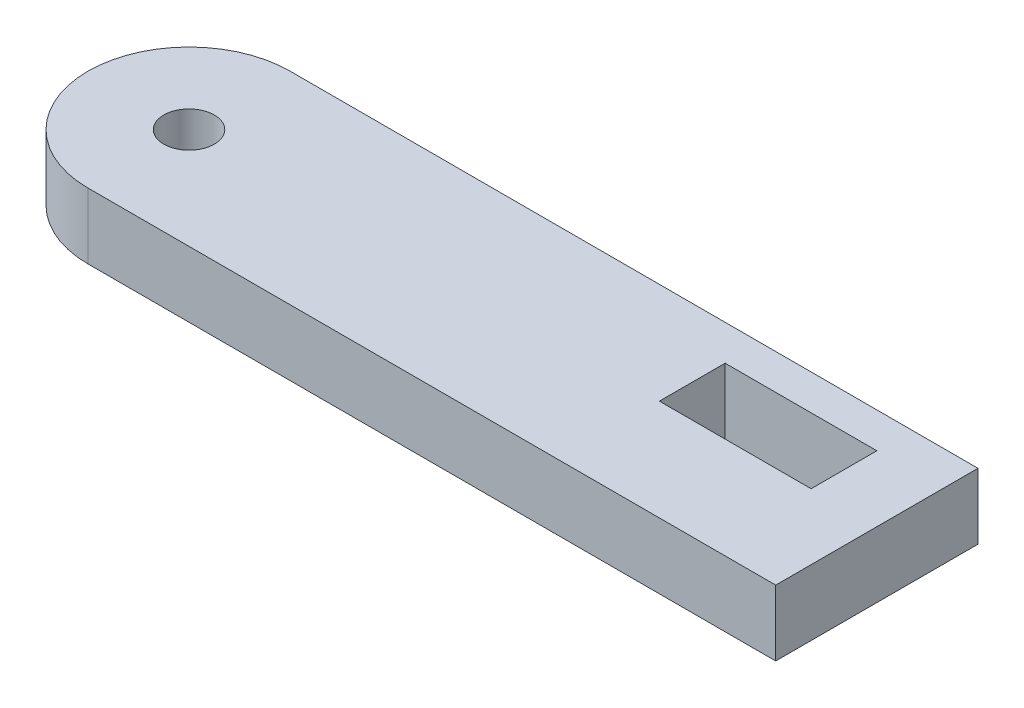
ISO-10303-21;
HEADER;
FILE_DESCRIPTION(('STEP AP214'),'2;1');
FILE_NAME('part.step','',(''),(''),'','','');
FILE_SCHEMA(('AUTOMOTIVE_DESIGN { 1 0 10303 214 1 1 1 1 }'));
ENDSEC;
DATA;
#1=APPLICATION_CONTEXT('core data for automotive mechanical design processes');
#2=APPLICATION_PROTOCOL_DEFINITION('international standard','automotive_design',2000,#1);
#3=PRODUCT_CONTEXT('',#1,'mechanical');
#4=PRODUCT('Part','Part','',(#3));
#5=PRODUCT_RELATED_PRODUCT_CATEGORY('part','',(#4));
#6=PRODUCT_DEFINITION_FORMATION('','',#4);
#7=PRODUCT_DEFINITION_CONTEXT('part definition',#1,'design');
#8=PRODUCT_DEFINITION('design','',#6,#7);
#9=PRODUCT_DEFINITION_SHAPE('','',#8);
#10=(LENGTH_UNIT() NAMED_UNIT(*) SI_UNIT(.MILLI.,.METRE.));
#11=(NAMED_UNIT(*) PLANE_ANGLE_UNIT() SI_UNIT($,.RADIAN.));
#12=(NAMED_UNIT(*) SI_UNIT($,.STERADIAN.) SOLID_ANGLE_UNIT());
#13=UNCERTAINTY_MEASURE_WITH_UNIT(LENGTH_MEASURE(1.E-05),#10,'distance_accuracy_value','');
#14=(GEOMETRIC_REPRESENTATION_CONTEXT(3) GLOBAL_UNCERTAINTY_ASSIGNED_CONTEXT((#13)) GLOBAL_UNIT_ASSIGNED_CONTEXT((#10,
#11,#12)) REPRESENTATION_CONTEXT('',''));
#15=CARTESIAN_POINT('',(0.,0.,0.));
#16=DIRECTION('',(0.,0.,1.));
#17=DIRECTION('',(1.,0.,0.));
#18=AXIS2_PLACEMENT_3D('',#15,#16,#17);
#19=CARTESIAN_POINT('',(0.,6.5,0.));
#20=DIRECTION('',(0.,0.,-1.));
#21=DIRECTION('',(-1.,0.,0.));
#22=AXIS2_PLACEMENT_3D('',#19,#20,#21);
#23=PLANE('',#22);
#24=DIRECTION('',(1.,0.,0.));
#25=VECTOR('',#24,1.);
#26=CARTESIAN_POINT('',(0.,6.5,0.));
#27=LINE('',#26,#25);
#28=CARTESIAN_POINT('',(10.,6.5,0.));
#29=VERTEX_POINT('',#28);
#30=CARTESIAN_POINT('',(78.,6.5,0.));
#31=VERTEX_POINT('',#30);
#32=EDGE_CURVE('E155',#29,#31,#27,.T.);
#33=ORIENTED_EDGE('',*,*,#32,.F.);
#34=DIRECTION('',(0.,-1.,0.));
#35=VECTOR('',#34,1.);
#36=CARTESIAN_POINT('',(10.,6.5,0.));
#37=LINE('',#36,#35);
#38=CARTESIAN_POINT('',(10.,0.,0.));
#39=VERTEX_POINT('',#38);
#40=EDGE_CURVE('E172',#29,#39,#37,.T.);
#41=ORIENTED_EDGE('',*,*,#40,.T.);
#42=DIRECTION('',(1.,0.,0.));
#43=VECTOR('',#42,1.);
#44=CARTESIAN_POINT('',(0.,0.,0.));
#45=LINE('',#44,#43);
#46=CARTESIAN_POINT('',(78.,0.,0.));
#47=VERTEX_POINT('',#46);
#48=EDGE_CURVE('E152',#39,#47,#45,.T.);
#49=ORIENTED_EDGE('',*,*,#48,.T.);
#50=DIRECTION('',(0.,-1.,0.));
#51=VECTOR('',#50,1.);
#52=CARTESIAN_POINT('',(78.,6.5,0.));
#53=LINE('',#52,#51);
#54=EDGE_CURVE('E169',#31,#47,#53,.T.);
#55=ORIENTED_EDGE('',*,*,#54,.F.);
#56=EDGE_LOOP('',(#33,#41,#49,#55));
#57=FACE_BOUND('',#56,.T.);
#58=ADVANCED_FACE('F33',(#57),#23,.F.);
#59=CARTESIAN_POINT('',(78.,6.5,0.));
#60=DIRECTION('',(-1.,0.,0.));
#61=DIRECTION('',(0.,0.,1.));
#62=AXIS2_PLACEMENT_3D('',#59,#60,#61);
#63=PLANE('',#62);
#64=DIRECTION('',(0.,0.,-1.));
#65=VECTOR('',#64,1.);
#66=CARTESIAN_POINT('',(78.,0.,0.));
#67=LINE('',#66,#65);
#68=CARTESIAN_POINT('',(78.,0.,-20.));
#69=VERTEX_POINT('',#68);
#70=EDGE_CURVE('E164',#47,#69,#67,.T.);
#71=ORIENTED_EDGE('',*,*,#70,.T.);
#72=DIRECTION('',(0.,-1.,0.));
#73=VECTOR('',#72,1.);
#74=CARTESIAN_POINT('',(78.,6.5,-20.));
#75=LINE('',#74,#73);
#76=CARTESIAN_POINT('',(78.,6.5,-20.));
#77=VERTEX_POINT('',#76);
#78=EDGE_CURVE('E162',#77,#69,#75,.T.);
#79=ORIENTED_EDGE('',*,*,#78,.F.);
#80=DIRECTION('',(0.,0.,-1.));
#81=VECTOR('',#80,1.);
#82=CARTESIAN_POINT('',(78.,6.5,0.));
#83=LINE('',#82,#81);
#84=EDGE_CURVE('E157',#31,#77,#83,.T.);
#85=ORIENTED_EDGE('',*,*,#84,.F.);
#86=ORIENTED_EDGE('',*,*,#54,.T.);
#87=EDGE_LOOP('',(#71,#79,#85,#86));
#88=FACE_BOUND('',#87,.T.);
#89=ADVANCED_FACE('F204',(#88),#63,.F.);
#90=CARTESIAN_POINT('',(0.,6.5,-20.));
#91=DIRECTION('',(0.,0.,1.));
#92=DIRECTION('',(1.,0.,0.));
#93=AXIS2_PLACEMENT_3D('',#90,#91,#92);
#94=PLANE('',#93);
#95=DIRECTION('',(-1.,0.,0.));
#96=VECTOR('',#95,1.);
#97=CARTESIAN_POINT('',(0.,0.,-20.));
#98=LINE('',#97,#96);
#99=CARTESIAN_POINT('',(10.,0.,-20.));
#100=VERTEX_POINT('',#99);
#101=EDGE_CURVE('E158',#69,#100,#98,.T.);
#102=ORIENTED_EDGE('',*,*,#101,.T.);
#103=DIRECTION('',(0.,-1.,0.));
#104=VECTOR('',#103,1.);
#105=CARTESIAN_POINT('',(10.,6.5,-20.));
#106=LINE('',#105,#104);
#107=CARTESIAN_POINT('',(10.,6.5,-20.));
#108=VERTEX_POINT('',#107);
#109=EDGE_CURVE('E11',#100,#108,#106,.F.);
#110=ORIENTED_EDGE('',*,*,#109,.T.);
#111=DIRECTION('',(-1.,0.,0.));
#112=VECTOR('',#111,1.);
#113=CARTESIAN_POINT('',(0.,6.5,-20.));
#114=LINE('',#113,#112);
#115=EDGE_CURVE('E160',#77,#108,#114,.T.);
#116=ORIENTED_EDGE('',*,*,#115,.F.);
#117=ORIENTED_EDGE('',*,*,#78,.T.);
#118=EDGE_LOOP('',(#102,#110,#116,#117));
#119=FACE_BOUND('',#118,.T.);
#120=ADVANCED_FACE('F209',(#119),#94,.F.);
#121=CARTESIAN_POINT('',(0.,6.5,0.));
#122=DIRECTION('',(0.,-1.,0.));
#123=DIRECTION('',(0.,0.,-1.));
#124=AXIS2_PLACEMENT_3D('',#121,#122,#123);
#125=PLANE('',#124);
#126=DIRECTION('',(-1.,0.,0.));
#127=VECTOR('',#126,1.);
#128=CARTESIAN_POINT('',(71.5,6.5,-16.5));
#129=LINE('',#128,#127);
#130=CARTESIAN_POINT('',(71.5,6.5,-16.5));
#131=VERTEX_POINT('',#130);
#132=CARTESIAN_POINT('',(56.5,6.5,-16.5));
#133=VERTEX_POINT('',#132);
#134=EDGE_CURVE('E139',#131,#133,#129,.T.);
#135=ORIENTED_EDGE('',*,*,#134,.F.);
#136=DIRECTION('',(0.,0.,-1.));
#137=VECTOR('',#136,1.);
#138=CARTESIAN_POINT('',(71.5,6.5,-16.5));
#139=LINE('',#138,#137);
#140=CARTESIAN_POINT('',(71.5,6.5,-10.));
#141=VERTEX_POINT('',#140);
#142=EDGE_CURVE('E112',#141,#131,#139,.T.);
#143=ORIENTED_EDGE('',*,*,#142,.F.);
#144=DIRECTION('',(1.,0.,0.));
#145=VECTOR('',#144,1.);
#146=CARTESIAN_POINT('',(71.5,6.5,-10.));
#147=LINE('',#146,#145);
#148=CARTESIAN_POINT('',(56.5,6.5,-10.));
#149=VERTEX_POINT('',#148);
#150=EDGE_CURVE('E130',#149,#141,#147,.T.);
#151=ORIENTED_EDGE('',*,*,#150,.F.);
#152=DIRECTION('',(0.,0.,1.));
#153=VECTOR('',#152,1.);
#154=CARTESIAN_POINT('',(56.5,6.5,-16.5));
#155=LINE('',#154,#153);
#156=EDGE_CURVE('E133',#133,#149,#155,.T.);
#157=ORIENTED_EDGE('',*,*,#156,.F.);
#158=EDGE_LOOP('',(#135,#143,#151,#157));
#159=FACE_BOUND('',#158,.T.);
#160=CARTESIAN_POINT('',(10.,6.5,-10.));
#161=DIRECTION('',(0.,1.,0.));
#162=DIRECTION('',(0.,0.,1.));
#163=AXIS2_PLACEMENT_3D('',#160,#161,#162);
#164=CIRCLE('',#163,2.5);
#165=CARTESIAN_POINT('',(10.,6.5,-7.5));
#166=VERTEX_POINT('',#165);
#167=EDGE_CURVE('E145',#166,#166,#164,.T.);
#168=ORIENTED_EDGE('',*,*,#167,.F.);
#169=EDGE_LOOP('',(#168));
#170=FACE_BOUND('',#169,.T.);
#171=CARTESIAN_POINT('',(10.,6.5,-10.));
#172=DIRECTION('',(0.,-1.,0.));
#173=DIRECTION('',(0.,0.,-1.));
#174=AXIS2_PLACEMENT_3D('',#171,#172,#173);
#175=CIRCLE('',#174,10.);
#176=CARTESIAN_POINT('',(0.,6.5,-10.));
#177=VERTEX_POINT('',#176);
#178=EDGE_CURVE('E54',#108,#177,#175,.F.);
#179=ORIENTED_EDGE('',*,*,#178,.T.);
#180=CARTESIAN_POINT('',(10.,6.5,-10.));
#181=DIRECTION('',(0.,-1.,0.));
#182=DIRECTION('',(0.,0.,-1.));
#183=AXIS2_PLACEMENT_3D('',#180,#181,#182);
#184=CIRCLE('',#183,10.);
#185=EDGE_CURVE('E42',#177,#29,#184,.F.);
#186=ORIENTED_EDGE('',*,*,#185,.T.);
#187=ORIENTED_EDGE('',*,*,#32,.T.);
#188=ORIENTED_EDGE('',*,*,#84,.T.);
#189=ORIENTED_EDGE('',*,*,#115,.T.);
#190=EDGE_LOOP('',(#179,#186,#187,#188,#189));
#191=FACE_BOUND('',#190,.T.);
#192=ADVANCED_FACE('F182',(#159,#170,#191),#125,.F.);
#193=CARTESIAN_POINT('',(0.,0.,0.));
#194=DIRECTION('',(0.,-1.,0.));
#195=DIRECTION('',(0.,0.,-1.));
#196=AXIS2_PLACEMENT_3D('',#193,#194,#195);
#197=PLANE('',#196);
#198=DIRECTION('',(0.,0.,-1.));
#199=VECTOR('',#198,1.);
#200=CARTESIAN_POINT('',(71.5,0.,-16.5));
#201=LINE('',#200,#199);
#202=CARTESIAN_POINT('',(71.5,0.,-10.));
#203=VERTEX_POINT('',#202);
#204=CARTESIAN_POINT('',(71.5,0.,-16.5));
#205=VERTEX_POINT('',#204);
#206=EDGE_CURVE('E109',#203,#205,#201,.T.);
#207=ORIENTED_EDGE('',*,*,#206,.T.);
#208=DIRECTION('',(-1.,0.,0.));
#209=VECTOR('',#208,1.);
#210=CARTESIAN_POINT('',(71.5,0.,-16.5));
#211=LINE('',#210,#209);
#212=CARTESIAN_POINT('',(56.5,0.,-16.5));
#213=VERTEX_POINT('',#212);
#214=EDGE_CURVE('E121',#205,#213,#211,.T.);
#215=ORIENTED_EDGE('',*,*,#214,.T.);
#216=DIRECTION('',(0.,0.,1.));
#217=VECTOR('',#216,1.);
#218=CARTESIAN_POINT('',(56.5,0.,-16.5));
#219=LINE('',#218,#217);
#220=CARTESIAN_POINT('',(56.5,0.,-10.));
#221=VERTEX_POINT('',#220);
#222=EDGE_CURVE('E125',#213,#221,#219,.T.);
#223=ORIENTED_EDGE('',*,*,#222,.T.);
#224=DIRECTION('',(1.,0.,0.));
#225=VECTOR('',#224,1.);
#226=CARTESIAN_POINT('',(71.5,0.,-10.));
#227=LINE('',#226,#225);
#228=EDGE_CURVE('E117',#221,#203,#227,.T.);
#229=ORIENTED_EDGE('',*,*,#228,.T.);
#230=EDGE_LOOP('',(#207,#215,#223,#229));
#231=FACE_BOUND('',#230,.T.);
#232=CARTESIAN_POINT('',(10.,0.,-10.));
#233=DIRECTION('',(0.,1.,0.));
#234=DIRECTION('',(0.,0.,1.));
#235=AXIS2_PLACEMENT_3D('',#232,#233,#234);
#236=CIRCLE('',#235,2.5);
#237=CARTESIAN_POINT('',(10.,0.,-7.5));
#238=VERTEX_POINT('',#237);
#239=EDGE_CURVE('E149',#238,#238,#236,.T.);
#240=ORIENTED_EDGE('',*,*,#239,.T.);
#241=EDGE_LOOP('',(#240));
#242=FACE_BOUND('',#241,.T.);
#243=ORIENTED_EDGE('',*,*,#48,.F.);
#244=CARTESIAN_POINT('',(10.,0.,-10.));
#245=DIRECTION('',(0.,-1.,0.));
#246=DIRECTION('',(0.,0.,-1.));
#247=AXIS2_PLACEMENT_3D('',#244,#245,#246);
#248=CIRCLE('',#247,10.);
#249=CARTESIAN_POINT('',(0.,0.,-10.));
#250=VERTEX_POINT('',#249);
#251=EDGE_CURVE('E177',#39,#250,#248,.T.);
#252=ORIENTED_EDGE('',*,*,#251,.T.);
#253=CARTESIAN_POINT('',(10.,0.,-10.));
#254=DIRECTION('',(0.,-1.,0.));
#255=DIRECTION('',(0.,0.,-1.));
#256=AXIS2_PLACEMENT_3D('',#253,#254,#255);
#257=CIRCLE('',#256,10.);
#258=EDGE_CURVE('E175',#250,#100,#257,.T.);
#259=ORIENTED_EDGE('',*,*,#258,.T.);
#260=ORIENTED_EDGE('',*,*,#101,.F.);
#261=ORIENTED_EDGE('',*,*,#70,.F.);
#262=EDGE_LOOP('',(#243,#252,#259,#260,#261));
#263=FACE_BOUND('',#262,.T.);
#264=ADVANCED_FACE('F127',(#231,#242,#263),#197,.T.);
#265=CARTESIAN_POINT('',(10.,0.,-10.));
#266=DIRECTION('',(0.,1.,0.));
#267=DIRECTION('',(0.,0.,1.));
#268=AXIS2_PLACEMENT_3D('',#265,#266,#267);
#269=CYLINDRICAL_SURFACE('',#268,2.5);
#270=CARTESIAN_POINT('',(10.,0.,-7.5));
#271=CARTESIAN_POINT('',(10.,0.0677083333333332,-7.5));
#272=CARTESIAN_POINT('',(10.,0.135416666666667,-7.5));
#273=CARTESIAN_POINT('',(10.,0.270833333333333,-7.5));
#274=CARTESIAN_POINT('',(10.,0.338541666666667,-7.5));
#275=CARTESIAN_POINT('',(10.,0.473958333333333,-7.5));
#276=CARTESIAN_POINT('',(10.,0.541666666666667,-7.5));
#277=CARTESIAN_POINT('',(10.,0.677083333333333,-7.5));
#278=CARTESIAN_POINT('',(10.,0.744791666666667,-7.5));
#279=CARTESIAN_POINT('',(10.,0.880208333333333,-7.5));
#280=CARTESIAN_POINT('',(10.,0.947916666666667,-7.5));
#281=CARTESIAN_POINT('',(10.,1.08333333333333,-7.5));
#282=CARTESIAN_POINT('',(10.,1.15104166666667,-7.5));
#283=CARTESIAN_POINT('',(10.,1.28645833333333,-7.5));
#284=CARTESIAN_POINT('',(10.,1.35416666666667,-7.5));
#285=CARTESIAN_POINT('',(10.,1.48958333333333,-7.5));
#286=CARTESIAN_POINT('',(10.,1.55729166666667,-7.5));
#287=CARTESIAN_POINT('',(10.,1.69270833333333,-7.5));
#288=CARTESIAN_POINT('',(10.,1.76041666666667,-7.5));
#289=CARTESIAN_POINT('',(10.,1.89583333333333,-7.5));
#290=CARTESIAN_POINT('',(10.,1.96354166666667,-7.5));
#291=CARTESIAN_POINT('',(10.,2.09895833333333,-7.5));
#292=CARTESIAN_POINT('',(10.,2.16666666666667,-7.5));
#293=CARTESIAN_POINT('',(10.,2.30208333333333,-7.5));
#294=CARTESIAN_POINT('',(10.,2.36979166666667,-7.5));
#295=CARTESIAN_POINT('',(10.,2.50520833333333,-7.5));
#296=CARTESIAN_POINT('',(10.,2.57291666666667,-7.5));
#297=CARTESIAN_POINT('',(10.,2.70833333333333,-7.5));
#298=CARTESIAN_POINT('',(10.,2.77604166666667,-7.5));
#299=CARTESIAN_POINT('',(10.,2.91145833333333,-7.5));
#300=CARTESIAN_POINT('',(10.,2.97916666666667,-7.5));
#301=CARTESIAN_POINT('',(10.,3.11458333333333,-7.5));
#302=CARTESIAN_POINT('',(10.,3.18229166666667,-7.5));
#303=CARTESIAN_POINT('',(10.,3.31770833333333,-7.5));
#304=CARTESIAN_POINT('',(10.,3.38541666666667,-7.5));
#305=CARTESIAN_POINT('',(10.,3.52083333333333,-7.5));
#306=CARTESIAN_POINT('',(10.,3.58854166666667,-7.5));
#307=CARTESIAN_POINT('',(10.,3.72395833333333,-7.5));
#308=CARTESIAN_POINT('',(10.,3.79166666666667,-7.5));
#309=CARTESIAN_POINT('',(10.,3.92708333333333,-7.5));
#310=CARTESIAN_POINT('',(10.,3.99479166666667,-7.5));
#311=CARTESIAN_POINT('',(10.,4.13020833333333,-7.5));
#312=CARTESIAN_POINT('',(10.,4.19791666666667,-7.5));
#313=CARTESIAN_POINT('',(10.,4.33333333333333,-7.5));
#314=CARTESIAN_POINT('',(10.,4.40104166666667,-7.5));
#315=CARTESIAN_POINT('',(10.,4.53645833333333,-7.5));
#316=CARTESIAN_POINT('',(10.,4.60416666666667,-7.5));
#317=CARTESIAN_POINT('',(10.,4.73958333333333,-7.5));
#318=CARTESIAN_POINT('',(10.,4.80729166666667,-7.5));
#319=CARTESIAN_POINT('',(10.,4.94270833333333,-7.5));
#320=CARTESIAN_POINT('',(10.,5.01041666666667,-7.5));
#321=CARTESIAN_POINT('',(10.,5.14583333333333,-7.5));
#322=CARTESIAN_POINT('',(10.,5.21354166666667,-7.5));
#323=CARTESIAN_POINT('',(10.,5.34895833333333,-7.5));
#324=CARTESIAN_POINT('',(10.,5.41666666666667,-7.5));
#325=CARTESIAN_POINT('',(10.,5.55208333333333,-7.5));
#326=CARTESIAN_POINT('',(10.,5.61979166666667,-7.5));
#327=CARTESIAN_POINT('',(10.,5.75520833333333,-7.5));
#328=CARTESIAN_POINT('',(10.,5.82291666666667,-7.5));
#329=CARTESIAN_POINT('',(10.,5.95833333333333,-7.5));
#330=CARTESIAN_POINT('',(10.,6.02604166666667,-7.5));
#331=CARTESIAN_POINT('',(10.,6.16145833333333,-7.5));
#332=CARTESIAN_POINT('',(10.,6.22916666666667,-7.5));
#333=CARTESIAN_POINT('',(10.,6.36458333333333,-7.5));
#334=CARTESIAN_POINT('',(10.,6.43229166666667,-7.5));
#335=CARTESIAN_POINT('',(10.,6.5,-7.5));
#336=B_SPLINE_CURVE_WITH_KNOTS('',3,(#270,#271,#272,#273,#274,#275,#276,#277,#278,#279,#280,
#281,#282,#283,#284,#285,#286,#287,#288,#289,#290,#291,#292,#293,#294,#295,#296,#297,#298,#299,
#300,#301,#302,#303,#304,#305,#306,#307,#308,#309,#310,#311,#312,#313,#314,#315,#316,#317,#318,
#319,#320,#321,#322,#323,#324,#325,#326,#327,#328,#329,#330,#331,#332,#333,#334,#335),
.UNSPECIFIED.,.F.,.F.,(4,2,2,2,2,2,2,2,2,2,2,2,2,2,2,2,2,2,2,2,2,2,2,2,2,2,2,2,2,2,2,2,4),(0.,
0.203125,0.40625,0.609375,0.8125,1.015625,1.21875,1.421875,1.625,1.828125,2.03125,2.234375,
2.4375,2.640625,2.84375,3.046875,3.25,3.453125,3.65625,3.859375,4.0625,4.265625,4.46875,
4.671875,4.875,5.078125,5.28125,5.484375,5.6875,5.890625,6.09375,6.296875,6.5),.UNSPECIFIED.);
#337=EDGE_CURVE('BSEAM217',#238,#166,#336,.T.);
#338=ORIENTED_EDGE('',*,*,#239,.F.);
#339=ORIENTED_EDGE('',*,*,#167,.T.);
#340=ORIENTED_EDGE('',*,*,#337,.T.);
#341=ORIENTED_EDGE('',*,*,#337,.F.);
#342=EDGE_LOOP('',(#338,#340,#339,#341));
#343=FACE_BOUND('',#342,.T.);
#344=ADVANCED_FACE('F217',(#343),#269,.F.);
#345=CARTESIAN_POINT('',(71.5,0.,-16.5));
#346=DIRECTION('',(1.,0.,0.));
#347=DIRECTION('',(0.,0.,-1.));
#348=AXIS2_PLACEMENT_3D('',#345,#346,#347);
#349=PLANE('',#348);
#350=ORIENTED_EDGE('',*,*,#142,.T.);
#351=DIRECTION('',(0.,1.,0.));
#352=VECTOR('',#351,1.);
#353=CARTESIAN_POINT('',(71.5,0.,-16.5));
#354=LINE('',#353,#352);
#355=EDGE_CURVE('E105',#205,#131,#354,.T.);
#356=ORIENTED_EDGE('',*,*,#355,.F.);
#357=ORIENTED_EDGE('',*,*,#206,.F.);
#358=DIRECTION('',(0.,1.,0.));
#359=VECTOR('',#358,1.);
#360=CARTESIAN_POINT('',(71.5,0.,-10.));
#361=LINE('',#360,#359);
#362=EDGE_CURVE('E143',#203,#141,#361,.T.);
#363=ORIENTED_EDGE('',*,*,#362,.T.);
#364=EDGE_LOOP('',(#350,#356,#357,#363));
#365=FACE_BOUND('',#364,.T.);
#366=ADVANCED_FACE('F107',(#365),#349,.F.);
#367=CARTESIAN_POINT('',(71.5,0.,-10.));
#368=DIRECTION('',(0.,0.,1.));
#369=DIRECTION('',(1.,0.,0.));
#370=AXIS2_PLACEMENT_3D('',#367,#368,#369);
#371=PLANE('',#370);
#372=ORIENTED_EDGE('',*,*,#150,.T.);
#373=ORIENTED_EDGE('',*,*,#362,.F.);
#374=ORIENTED_EDGE('',*,*,#228,.F.);
#375=DIRECTION('',(0.,1.,0.));
#376=VECTOR('',#375,1.);
#377=CARTESIAN_POINT('',(56.5,0.,-10.));
#378=LINE('',#377,#376);
#379=EDGE_CURVE('E146',#221,#149,#378,.T.);
#380=ORIENTED_EDGE('',*,*,#379,.T.);
#381=EDGE_LOOP('',(#372,#373,#374,#380));
#382=FACE_BOUND('',#381,.T.);
#383=ADVANCED_FACE('F225',(#382),#371,.F.);
#384=CARTESIAN_POINT('',(56.5,0.,-16.5));
#385=DIRECTION('',(-1.,0.,0.));
#386=DIRECTION('',(0.,0.,1.));
#387=AXIS2_PLACEMENT_3D('',#384,#385,#386);
#388=PLANE('',#387);
#389=ORIENTED_EDGE('',*,*,#156,.T.);
#390=ORIENTED_EDGE('',*,*,#379,.F.);
#391=ORIENTED_EDGE('',*,*,#222,.F.);
#392=DIRECTION('',(0.,1.,0.));
#393=VECTOR('',#392,1.);
#394=CARTESIAN_POINT('',(56.5,0.,-16.5));
#395=LINE('',#394,#393);
#396=EDGE_CURVE('E116',#213,#133,#395,.T.);
#397=ORIENTED_EDGE('',*,*,#396,.T.);
#398=EDGE_LOOP('',(#389,#390,#391,#397));
#399=FACE_BOUND('',#398,.T.);
#400=ADVANCED_FACE('F201',(#399),#388,.F.);
#401=CARTESIAN_POINT('',(71.5,0.,-16.5));
#402=DIRECTION('',(0.,0.,-1.));
#403=DIRECTION('',(-1.,0.,0.));
#404=AXIS2_PLACEMENT_3D('',#401,#402,#403);
#405=PLANE('',#404);
#406=ORIENTED_EDGE('',*,*,#134,.T.);
#407=ORIENTED_EDGE('',*,*,#396,.F.);
#408=ORIENTED_EDGE('',*,*,#214,.F.);
#409=ORIENTED_EDGE('',*,*,#355,.T.);
#410=EDGE_LOOP('',(#406,#407,#408,#409));
#411=FACE_BOUND('',#410,.T.);
#412=ADVANCED_FACE('F122',(#411),#405,.F.);
#413=CARTESIAN_POINT('',(10.,6.5,-10.));
#414=DIRECTION('',(0.,-1.,0.));
#415=DIRECTION('',(0.,0.,-1.));
#416=AXIS2_PLACEMENT_3D('',#413,#414,#415);
#417=CYLINDRICAL_SURFACE('',#416,10.);
#418=DIRECTION('',(0.,-1.,0.));
#419=VECTOR('',#418,1.);
#420=CARTESIAN_POINT('',(0.,6.5,-10.));
#421=LINE('',#420,#419);
#422=EDGE_CURVE('E37',#177,#250,#421,.T.);
#423=ORIENTED_EDGE('',*,*,#422,.F.);
#424=ORIENTED_EDGE('',*,*,#178,.F.);
#425=ORIENTED_EDGE('',*,*,#109,.F.);
#426=ORIENTED_EDGE('',*,*,#258,.F.);
#427=EDGE_LOOP('',(#423,#424,#425,#426));
#428=FACE_BOUND('',#427,.T.);
#429=ADVANCED_FACE('F35',(#428),#417,.T.);
#430=CARTESIAN_POINT('',(10.,6.5,-10.));
#431=DIRECTION('',(0.,-1.,0.));
#432=DIRECTION('',(0.,0.,-1.));
#433=AXIS2_PLACEMENT_3D('',#430,#431,#432);
#434=CYLINDRICAL_SURFACE('',#433,10.);
#435=ORIENTED_EDGE('',*,*,#185,.F.);
#436=ORIENTED_EDGE('',*,*,#422,.T.);
#437=ORIENTED_EDGE('',*,*,#251,.F.);
#438=ORIENTED_EDGE('',*,*,#40,.F.);
#439=EDGE_LOOP('',(#435,#436,#437,#438));
#440=FACE_BOUND('',#439,.T.);
#441=ADVANCED_FACE('F190',(#440),#434,.T.);
#442=CLOSED_SHELL('',(#58,#89,#120,#192,#264,#344,#366,#383,#400,#412,#429,#441));
#443=MANIFOLD_SOLID_BREP('B2',#442);
#444=ADVANCED_BREP_SHAPE_REPRESENTATION('',(#18,#443),#14);
#445=SHAPE_DEFINITION_REPRESENTATION(#9,#444);
ENDSEC;
END-ISO-10303-21;
